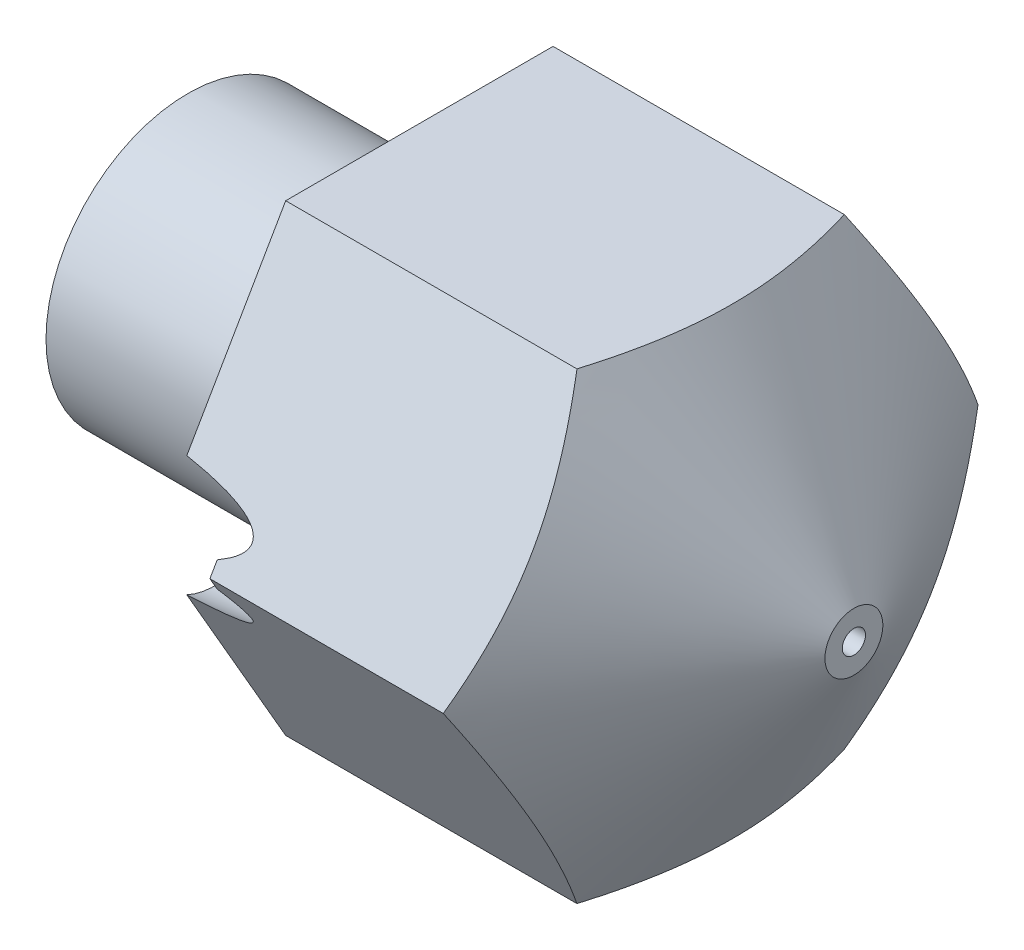
ISO-10303-21;
HEADER;
FILE_DESCRIPTION(('STEP AP214'),'2;1');
FILE_NAME('part.step','',(''),(''),'','','');
FILE_SCHEMA(('AUTOMOTIVE_DESIGN { 1 0 10303 214 1 1 1 1 }'));
ENDSEC;
DATA;
#1=APPLICATION_CONTEXT('core data for automotive mechanical design processes');
#2=APPLICATION_PROTOCOL_DEFINITION('international standard','automotive_design',2000,#1);
#3=PRODUCT_CONTEXT('',#1,'mechanical');
#4=PRODUCT('Part','Part','',(#3));
#5=PRODUCT_RELATED_PRODUCT_CATEGORY('part','',(#4));
#6=PRODUCT_DEFINITION_FORMATION('','',#4);
#7=PRODUCT_DEFINITION_CONTEXT('part definition',#1,'design');
#8=PRODUCT_DEFINITION('design','',#6,#7);
#9=PRODUCT_DEFINITION_SHAPE('','',#8);
#10=(LENGTH_UNIT() NAMED_UNIT(*) SI_UNIT(.MILLI.,.METRE.));
#11=(NAMED_UNIT(*) PLANE_ANGLE_UNIT() SI_UNIT($,.RADIAN.));
#12=(NAMED_UNIT(*) SI_UNIT($,.STERADIAN.) SOLID_ANGLE_UNIT());
#13=UNCERTAINTY_MEASURE_WITH_UNIT(LENGTH_MEASURE(1.E-05),#10,'distance_accuracy_value','');
#14=(GEOMETRIC_REPRESENTATION_CONTEXT(3) GLOBAL_UNCERTAINTY_ASSIGNED_CONTEXT((#13)) GLOBAL_UNIT_ASSIGNED_CONTEXT((#10,
#11,#12)) REPRESENTATION_CONTEXT('',''));
#15=CARTESIAN_POINT('',(0.,0.,0.));
#16=DIRECTION('',(0.,0.,1.));
#17=DIRECTION('',(1.,0.,0.));
#18=AXIS2_PLACEMENT_3D('',#15,#16,#17);
#19=CARTESIAN_POINT('',(-11.5064546427052,0.,4.618802153517));
#20=DIRECTION('',(0.,-0.5,0.866025403784439));
#21=DIRECTION('',(0.,-0.866025403784439,-0.5));
#22=AXIS2_PLACEMENT_3D('',#19,#20,#21);
#23=PLANE('',#22);
#24=DIRECTION('',(1.,0.,0.));
#25=VECTOR('',#24,1.);
#26=CARTESIAN_POINT('',(-11.5064546427052,0.,4.618802153517));
#27=LINE('',#26,#25);
#28=CARTESIAN_POINT('',(-6.50645464270517,0.,4.618802153517));
#29=VERTEX_POINT('',#28);
#30=CARTESIAN_POINT('',(-2.47482601161343,0.,4.618802153517));
#31=VERTEX_POINT('',#30);
#32=EDGE_CURVE('E115',#29,#31,#27,.T.);
#33=ORIENTED_EDGE('',*,*,#32,.F.);
#34=DIRECTION('',(0.,-0.866025403784439,-0.5));
#35=VECTOR('',#34,1.);
#36=CARTESIAN_POINT('',(-6.50645464270517,0.,4.618802153517));
#37=LINE('',#36,#35);
#38=CARTESIAN_POINT('',(-6.50645464270517,-0.218664139077677,4.49255635395839));
#39=VERTEX_POINT('',#38);
#40=EDGE_CURVE('E105',#29,#39,#37,.T.);
#41=ORIENTED_EDGE('',*,*,#40,.T.);
#42=CARTESIAN_POINT('',(-13.7241967777646,0.,4.618802153517));
#43=DIRECTION('',(0.,-0.5,0.866025403784439));
#44=DIRECTION('',(0.996136109887344,-0.0760568072816772,-0.0439114181577798));
#45=AXIS2_PLACEMENT_3D('',#42,#43,#44);
#46=ELLIPSE('',#45,7.64710368388143,1.15);
#47=CARTESIAN_POINT('',(-7.50645464270517,-1.04156382752938,4.01745499731474));
#48=VERTEX_POINT('',#47);
#49=EDGE_CURVE('E271',#39,#48,#46,.F.);
#50=ORIENTED_EDGE('',*,*,#49,.T.);
#51=DIRECTION('',(0.,-0.866025403784439,-0.5));
#52=VECTOR('',#51,1.);
#53=CARTESIAN_POINT('',(-7.50645464270517,-0.162500000000001,4.52498273477369));
#54=LINE('',#53,#52);
#55=CARTESIAN_POINT('',(-7.50645464270517,-4.,2.3094010767585));
#56=VERTEX_POINT('',#55);
#57=EDGE_CURVE('E212',#48,#56,#54,.T.);
#58=ORIENTED_EDGE('',*,*,#57,.T.);
#59=DIRECTION('',(1.,0.,0.));
#60=VECTOR('',#59,1.);
#61=CARTESIAN_POINT('',(-11.5064546427052,-4.,2.3094010767585));
#62=LINE('',#61,#60);
#63=CARTESIAN_POINT('',(-2.47482601161343,-4.,2.3094010767585));
#64=VERTEX_POINT('',#63);
#65=EDGE_CURVE('E123',#56,#64,#62,.T.);
#66=ORIENTED_EDGE('',*,*,#65,.T.);
#67=CARTESIAN_POINT('',(-2.47489539562319,-4.0002,2.30928560670466));
#68=CARTESIAN_POINT('',(-2.41367478697621,-3.82378429682606,2.41113926042142));
#69=CARTESIAN_POINT('',(-2.35797178173678,-3.64571916244249,2.51394521369105));
#70=CARTESIAN_POINT('',(-2.26076985854489,-3.28623804524028,2.72149173347634));
#71=CARTESIAN_POINT('',(-2.21930897658134,-3.10481443247441,2.82623670514407));
#72=CARTESIAN_POINT('',(-2.15499427747914,-2.74440433604145,3.0343195713383));
#73=CARTESIAN_POINT('',(-2.13167110146483,-2.56548305149692,3.13761982313383));
#74=CARTESIAN_POINT('',(-2.10412091253113,-2.20674872295431,3.34473518428547));
#75=CARTESIAN_POINT('',(-2.0998679636377,-2.02693722328528,3.44854940202277));
#76=CARTESIAN_POINT('',(-2.11006491766766,-1.6925623081736,3.64160084927276));
#77=CARTESIAN_POINT('',(-2.12201661064547,-1.53793649904065,3.73087410179934));
#78=CARTESIAN_POINT('',(-2.15945066700012,-1.229780492834,3.90878805493514));
#79=CARTESIAN_POINT('',(-2.18494668088695,-1.07625155972088,3.9974280257964));
#80=CARTESIAN_POINT('',(-2.24851595632026,-0.767426700908233,4.17572814116433));
#81=CARTESIAN_POINT('',(-2.28687487915166,-0.612176059364386,4.26536214085153));
#82=CARTESIAN_POINT('',(-2.37378030891487,-0.304163185150552,4.44319345669276));
#83=CARTESIAN_POINT('',(-2.42230484006763,-0.151396338503894,4.53139343672746));
#84=CARTESIAN_POINT('',(-2.47489539562319,0.000199999999999923,4.61891762357084));
#85=B_SPLINE_CURVE_WITH_KNOTS('',3,(#67,#68,#69,#70,#71,#72,#73,#74,#75,#76,#77,#78,#79,#80,#81,
#82,#83,#84),.UNSPECIFIED.,.F.,.F.,(4,2,2,2,2,2,2,2,4),(0.,0.638405548690308,1.27850304746714,
1.90142763305445,2.5235047685458,3.05979879780538,3.59663435398865,4.14628272995038,
4.69475492844599),.UNSPECIFIED.);
#86=EDGE_CURVE('E121',#64,#31,#85,.T.);
#87=ORIENTED_EDGE('',*,*,#86,.T.);
#88=EDGE_LOOP('',(#33,#41,#50,#58,#66,#87));
#89=FACE_BOUND('',#88,.T.);
#90=ADVANCED_FACE('F33',(#89),#23,.T.);
#91=CARTESIAN_POINT('',(-11.5064546427052,4.,2.3094010767585));
#92=DIRECTION('',(0.,0.5,0.866025403784439));
#93=DIRECTION('',(0.,-0.866025403784439,0.5));
#94=AXIS2_PLACEMENT_3D('',#91,#92,#93);
#95=PLANE('',#94);
#96=CARTESIAN_POINT('',(-13.7241967777646,0.,4.618802153517));
#97=DIRECTION('',(0.,0.5,0.866025403784439));
#98=DIRECTION('',(0.996136109887344,0.0760568072816771,-0.0439114181577798));
#99=AXIS2_PLACEMENT_3D('',#96,#97,#98);
#100=ELLIPSE('',#99,7.64710368388143,1.15);
#101=CARTESIAN_POINT('',(-7.50645464270517,1.04156382752938,4.01745499731474));
#102=VERTEX_POINT('',#101);
#103=CARTESIAN_POINT('',(-6.50645464270517,0.218664139077678,4.49255635395839));
#104=VERTEX_POINT('',#103);
#105=EDGE_CURVE('E42',#102,#104,#100,.F.);
#106=ORIENTED_EDGE('',*,*,#105,.T.);
#107=DIRECTION('',(0.,-0.866025403784439,0.5));
#108=VECTOR('',#107,1.);
#109=CARTESIAN_POINT('',(-6.50645464270517,4.,2.3094010767585));
#110=LINE('',#109,#108);
#111=EDGE_CURVE('E49',#104,#29,#110,.T.);
#112=ORIENTED_EDGE('',*,*,#111,.T.);
#113=ORIENTED_EDGE('',*,*,#32,.T.);
#114=CARTESIAN_POINT('',(-2.4748953956232,-0.000200000000000242,4.61891762357084));
#115=CARTESIAN_POINT('',(-2.41367478697621,0.176215703173942,4.51706396985409));
#116=CARTESIAN_POINT('',(-2.35797178173678,0.354280837557507,4.41425801658445));
#117=CARTESIAN_POINT('',(-2.26076985854489,0.713761954759723,4.20671149679917));
#118=CARTESIAN_POINT('',(-2.21930897658134,0.895185567525586,4.10196652513144));
#119=CARTESIAN_POINT('',(-2.15499427747914,1.25559566395855,3.89388365893721));
#120=CARTESIAN_POINT('',(-2.13167110146483,1.43451694850308,3.79058340714167));
#121=CARTESIAN_POINT('',(-2.10412091253113,1.79325127704569,3.58346804599004));
#122=CARTESIAN_POINT('',(-2.0998679636377,1.97306277671472,3.47965382825273));
#123=CARTESIAN_POINT('',(-2.11006491766766,2.3074376918264,3.28660238100275));
#124=CARTESIAN_POINT('',(-2.12201661064547,2.46206350095935,3.19732912847617));
#125=CARTESIAN_POINT('',(-2.15945066700012,2.77021950716599,3.01941517534037));
#126=CARTESIAN_POINT('',(-2.18494668088695,2.92374844027912,2.93077520447911));
#127=CARTESIAN_POINT('',(-2.24851595632026,3.23257329909177,2.75247508911118));
#128=CARTESIAN_POINT('',(-2.28687487915166,3.38782394063561,2.66284108942398));
#129=CARTESIAN_POINT('',(-2.37378030891487,3.69583681484945,2.48500977358275));
#130=CARTESIAN_POINT('',(-2.42230484006763,3.84860366149611,2.39680979354805));
#131=CARTESIAN_POINT('',(-2.4748953956232,4.0002,2.30928560670466));
#132=B_SPLINE_CURVE_WITH_KNOTS('',3,(#114,#115,#116,#117,#118,#119,#120,#121,#122,#123,#124,
#125,#126,#127,#128,#129,#130,#131),.UNSPECIFIED.,.F.,.F.,(4,2,2,2,2,2,2,2,4),(0.,
0.638405548690308,1.27850304746714,1.90142763305445,2.5235047685458,3.05979879780538,
3.59663435398865,4.14628272995038,4.69475492844599),.UNSPECIFIED.);
#133=CARTESIAN_POINT('',(-2.47482601161343,4.,2.3094010767585));
#134=VERTEX_POINT('',#133);
#135=EDGE_CURVE('E233',#31,#134,#132,.T.);
#136=ORIENTED_EDGE('',*,*,#135,.T.);
#137=DIRECTION('',(1.,0.,0.));
#138=VECTOR('',#137,1.);
#139=CARTESIAN_POINT('',(-11.5064546427052,4.,2.3094010767585));
#140=LINE('',#139,#138);
#141=CARTESIAN_POINT('',(-7.50645464270517,4.,2.3094010767585));
#142=VERTEX_POINT('',#141);
#143=EDGE_CURVE('E124',#142,#134,#140,.T.);
#144=ORIENTED_EDGE('',*,*,#143,.F.);
#145=DIRECTION('',(0.,-0.866025403784439,0.5));
#146=VECTOR('',#145,1.);
#147=CARTESIAN_POINT('',(-7.50645464270517,3.8375,2.40322049550182));
#148=LINE('',#147,#146);
#149=EDGE_CURVE('E210',#142,#102,#148,.T.);
#150=ORIENTED_EDGE('',*,*,#149,.T.);
#151=EDGE_LOOP('',(#106,#112,#113,#136,#144,#150));
#152=FACE_BOUND('',#151,.T.);
#153=ADVANCED_FACE('F114',(#152),#95,.T.);
#154=CARTESIAN_POINT('',(-1.80463913019382,0.,2.51706254214026));
#155=DIRECTION('',(0.984807753012207,0.,-0.173648177666938));
#156=DIRECTION('',(-0.173648177666938,0.,-0.984807753012207));
#157=AXIS2_PLACEMENT_3D('',#154,#155,#156);
#158=CYLINDRICAL_SURFACE('',#157,1.15);
#159=CARTESIAN_POINT('',(-2.48513115570659,0.,2.63705164639512));
#160=DIRECTION('',(0.984807753012207,0.,-0.173648177666938));
#161=DIRECTION('',(-0.173648177666938,0.,-0.984807753012207));
#162=AXIS2_PLACEMENT_3D('',#159,#160,#161);
#163=CIRCLE('',#162,1.15);
#164=CARTESIAN_POINT('',(-2.68482656002357,0.,1.50452273043108));
#165=VERTEX_POINT('',#164);
#166=EDGE_CURVE('E110',#165,#165,#163,.T.);
#167=ORIENTED_EDGE('',*,*,#166,.T.);
#168=EDGE_LOOP('',(#167));
#169=FACE_BOUND('',#168,.T.);
#170=ORIENTED_EDGE('',*,*,#49,.F.);
#171=CARTESIAN_POINT('',(-6.50645464270517,0.,3.34611947530964));
#172=DIRECTION('',(-1.,0.,0.));
#173=DIRECTION('',(0.,0.,-1.));
#174=AXIS2_PLACEMENT_3D('',#171,#172,#173);
#175=ELLIPSE('',#174,1.16774060366861,1.15);
#176=EDGE_CURVE('E12',#39,#104,#175,.T.);
#177=ORIENTED_EDGE('',*,*,#176,.T.);
#178=ORIENTED_EDGE('',*,*,#105,.F.);
#179=CARTESIAN_POINT('',(-7.50645464270517,0.,3.52244645601812));
#180=DIRECTION('',(1.,0.,0.));
#181=DIRECTION('',(0.,0.,-1.));
#182=AXIS2_PLACEMENT_3D('',#179,#180,#181);
#183=ELLIPSE('',#182,1.16774060366861,1.15);
#184=CARTESIAN_POINT('',(-7.50645464270516,0.380101452319349,2.42033528378709));
#185=VERTEX_POINT('',#184);
#186=EDGE_CURVE('E244',#102,#185,#183,.F.);
#187=ORIENTED_EDGE('',*,*,#186,.T.);
#188=CARTESIAN_POINT('',(-7.50645464270516,0.380101452319349,2.42033528378709));
#189=CARTESIAN_POINT('',(-7.53164557622106,0.371435900180456,2.42169599242348));
#190=CARTESIAN_POINT('',(-7.5567329046638,0.362487884122019,2.42305426441452));
#191=CARTESIAN_POINT('',(-7.60668126871648,0.343879584693786,2.42576466352813));
#192=CARTESIAN_POINT('',(-7.63154194285403,0.334218332152243,2.42711677953681));
#193=CARTESIAN_POINT('',(-7.70545189893425,0.304061201673389,2.43114548191707));
#194=CARTESIAN_POINT('',(-7.75403308885711,0.282324234012543,2.43380544463165));
#195=CARTESIAN_POINT('',(-7.821767948487,0.24711175827591,2.43752905836251));
#196=CARTESIAN_POINT('',(-7.84207994516474,0.235881814722992,2.43864771852817));
#197=CARTESIAN_POINT('',(-7.88197417843386,0.211908624149625,2.44084854035234));
#198=CARTESIAN_POINT('',(-7.90155164505592,0.199157187743113,2.44193046016505));
#199=CARTESIAN_POINT('',(-7.93957156096945,0.171441116837734,2.44403485015953));
#200=CARTESIAN_POINT('',(-7.9579908865134,0.156444385121634,2.4450560947584));
#201=CARTESIAN_POINT('',(-7.99194195256509,0.123490803109564,2.44694107390681));
#202=CARTESIAN_POINT('',(-8.00750119895349,0.105565665798615,2.44780630711413));
#203=CARTESIAN_POINT('',(-8.02465794934448,0.0782455904227737,2.44876121908476));
#204=CARTESIAN_POINT('',(-8.02889427079774,0.0705450958185572,2.44899711121059));
#205=CARTESIAN_POINT('',(-8.03620780265041,0.0546031161092929,2.4494044571606));
#206=CARTESIAN_POINT('',(-8.03928580869984,0.0463620069400535,2.44957595521706));
#207=CARTESIAN_POINT('',(-8.0440032331517,0.0293659468760754,2.44983883412218));
#208=CARTESIAN_POINT('',(-8.04562655819751,0.0206063637979844,2.44992931869706));
#209=CARTESIAN_POINT('',(-8.04714791533786,0.0029374474368664,2.45001411866368));
#210=CARTESIAN_POINT('',(-8.04704710882139,-0.00597178100285546,2.45000849879216));
#211=CARTESIAN_POINT('',(-8.04524803036998,-0.0226120057340384,2.4499082206434));
#212=CARTESIAN_POINT('',(-8.04372915363584,-0.0303636008972351,2.44982356138466));
#213=CARTESIAN_POINT('',(-8.0395127256261,-0.0455341912722249,2.44958859981077));
#214=CARTESIAN_POINT('',(-8.03681445405622,-0.0529529801707095,2.44943825738081));
#215=CARTESIAN_POINT('',(-8.02874730812015,-0.0712506575162645,2.44898891261733));
#216=CARTESIAN_POINT('',(-8.02272300890597,-0.0818368463904243,2.44865346729553));
#217=CARTESIAN_POINT('',(-8.00914337013584,-0.101971747589523,2.44789780946839));
#218=CARTESIAN_POINT('',(-8.00158325637706,-0.11151707853701,2.44747733265477));
#219=CARTESIAN_POINT('',(-7.97770997501408,-0.138454926868376,2.44615053656435));
#220=CARTESIAN_POINT('',(-7.95997361076383,-0.154561353514317,2.44516600805385));
#221=CARTESIAN_POINT('',(-7.92254451836607,-0.184459325357858,2.44309185555301));
#222=CARTESIAN_POINT('',(-7.90283718982718,-0.198231190447342,2.44200144928932));
#223=CARTESIAN_POINT('',(-7.85279184553058,-0.23019202888415,2.4392373995569));
#224=CARTESIAN_POINT('',(-7.8218307447365,-0.247393290658528,2.43753162381855));
#225=CARTESIAN_POINT('',(-7.7586755339149,-0.279461884113285,2.4340619145898));
#226=CARTESIAN_POINT('',(-7.72647841482851,-0.29432300295349,2.43229784084415));
#227=CARTESIAN_POINT('',(-7.66310400683827,-0.321616166427211,2.42883571108761));
#228=CARTESIAN_POINT('',(-7.63196383459694,-0.334135463711245,2.4271391481308));
#229=CARTESIAN_POINT('',(-7.5694076727318,-0.357937424025205,2.42374068794934));
#230=CARTESIAN_POINT('',(-7.5379941236128,-0.36922647693033,2.42203887066743));
#231=CARTESIAN_POINT('',(-7.50645464270516,-0.380101452319349,2.42033528378709));
#232=B_SPLINE_CURVE_WITH_KNOTS('',3,(#188,#189,#190,#191,#192,#193,#194,#195,#196,#197,#198,
#199,#200,#201,#202,#203,#204,#205,#206,#207,#208,#209,#210,#211,#212,#213,#214,#215,#216,#217,
#218,#219,#220,#221,#222,#223,#224,#225,#226,#227,#228,#229,#230,#231),.UNSPECIFIED.,.F.,.F.,(4,
2,2,2,2,2,2,2,2,2,2,2,2,2,2,2,2,2,2,2,2,4),(0.,0.0800071136384732,0.160125019187223,
0.319715732000404,0.389389771677658,0.45945735456332,0.530644094508613,0.601105612154475,
0.627408038024021,0.653692363563392,0.680264009594907,0.70681775745573,0.730410359933461,
0.754017391347453,0.790360980955193,0.826819325545735,0.898355501240315,0.970467586938541,
1.07665380964378,1.18311735827324,1.28390617303383,1.38414366615221),.UNSPECIFIED.);
#233=CARTESIAN_POINT('',(-7.50645464270516,-0.380101452319349,2.42033528378709));
#234=VERTEX_POINT('',#233);
#235=EDGE_CURVE('E136',#185,#234,#232,.T.);
#236=ORIENTED_EDGE('',*,*,#235,.T.);
#237=EDGE_CURVE('E243',#234,#48,#183,.F.);
#238=ORIENTED_EDGE('',*,*,#237,.T.);
#239=EDGE_LOOP('',(#170,#177,#178,#187,#236,#238));
#240=FACE_BOUND('',#239,.T.);
#241=ADVANCED_FACE('F249',(#169,#240),#158,.F.);
#242=CARTESIAN_POINT('',(-7.50645464270517,2.45,0.));
#243=DIRECTION('',(1.,0.,0.));
#244=DIRECTION('',(0.,0.,-1.));
#245=AXIS2_PLACEMENT_3D('',#242,#243,#244);
#246=PLANE('',#245);
#247=ORIENTED_EDGE('',*,*,#237,.F.);
#248=CARTESIAN_POINT('',(-7.50645464270516,0.,0.));
#249=DIRECTION('',(-1.,0.,0.));
#250=DIRECTION('',(0.,0.,1.));
#251=AXIS2_PLACEMENT_3D('',#248,#249,#250);
#252=CIRCLE('',#251,2.45);
#253=EDGE_CURVE('E173',#185,#234,#252,.T.);
#254=ORIENTED_EDGE('',*,*,#253,.F.);
#255=ORIENTED_EDGE('',*,*,#186,.F.);
#256=ORIENTED_EDGE('',*,*,#149,.F.);
#257=DIRECTION('',(0.,0.,1.));
#258=VECTOR('',#257,1.);
#259=CARTESIAN_POINT('',(-7.50645464270517,4.,0.));
#260=LINE('',#259,#258);
#261=CARTESIAN_POINT('',(-7.50645464270517,4.,-2.3094010767585));
#262=VERTEX_POINT('',#261);
#263=EDGE_CURVE('E208',#262,#142,#260,.T.);
#264=ORIENTED_EDGE('',*,*,#263,.F.);
#265=DIRECTION('',(0.,0.866025403784439,0.5));
#266=VECTOR('',#265,1.);
#267=CARTESIAN_POINT('',(-7.50645464270517,3.8375,-2.40322049550182));
#268=LINE('',#267,#266);
#269=CARTESIAN_POINT('',(-7.50645464270517,0.,-4.61880215351701));
#270=VERTEX_POINT('',#269);
#271=EDGE_CURVE('E206',#270,#262,#268,.T.);
#272=ORIENTED_EDGE('',*,*,#271,.F.);
#273=DIRECTION('',(0.,0.866025403784439,-0.5));
#274=VECTOR('',#273,1.);
#275=CARTESIAN_POINT('',(-7.50645464270517,-0.162500000000001,-4.52498273477369));
#276=LINE('',#275,#274);
#277=CARTESIAN_POINT('',(-7.50645464270517,-4.,-2.30940107675851));
#278=VERTEX_POINT('',#277);
#279=EDGE_CURVE('E216',#278,#270,#276,.T.);
#280=ORIENTED_EDGE('',*,*,#279,.F.);
#281=DIRECTION('',(0.,0.,-1.));
#282=VECTOR('',#281,1.);
#283=CARTESIAN_POINT('',(-7.50645464270517,-4.,0.));
#284=LINE('',#283,#282);
#285=EDGE_CURVE('E214',#56,#278,#284,.T.);
#286=ORIENTED_EDGE('',*,*,#285,.F.);
#287=ORIENTED_EDGE('',*,*,#57,.F.);
#288=EDGE_LOOP('',(#247,#254,#255,#256,#264,#272,#280,#286,#287));
#289=FACE_BOUND('',#288,.T.);
#290=ADVANCED_FACE('F164',(#289),#246,.F.);
#291=CARTESIAN_POINT('',(-1000.,0.,0.));
#292=DIRECTION('',(-1.,0.,0.));
#293=DIRECTION('',(0.,0.,1.));
#294=AXIS2_PLACEMENT_3D('',#291,#292,#293);
#295=CYLINDRICAL_SURFACE('',#294,2.45);
#296=CARTESIAN_POINT('',(-11.5064546427052,0.,0.));
#297=DIRECTION('',(-1.,0.,0.));
#298=DIRECTION('',(0.,0.,1.));
#299=AXIS2_PLACEMENT_3D('',#296,#297,#298);
#300=CIRCLE('',#299,2.45);
#301=CARTESIAN_POINT('',(-11.5064546427052,0.,2.45));
#302=VERTEX_POINT('',#301);
#303=EDGE_CURVE('E182',#302,#302,#300,.T.);
#304=ORIENTED_EDGE('',*,*,#303,.F.);
#305=EDGE_LOOP('',(#304));
#306=FACE_BOUND('',#305,.T.);
#307=ORIENTED_EDGE('',*,*,#235,.F.);
#308=ORIENTED_EDGE('',*,*,#253,.T.);
#309=EDGE_LOOP('',(#307,#308));
#310=FACE_BOUND('',#309,.T.);
#311=ADVANCED_FACE('F246',(#306,#310),#295,.T.);
#312=CARTESIAN_POINT('',(0.,0.,0.));
#313=DIRECTION('',(-1.,0.,0.));
#314=DIRECTION('',(0.,0.,1.));
#315=AXIS2_PLACEMENT_3D('',#312,#313,#314);
#316=CONICAL_SURFACE('',#315,0.5,1.02974425867681);
#317=CARTESIAN_POINT('',(0.,0.,0.));
#318=DIRECTION('',(-1.,0.,0.));
#319=DIRECTION('',(0.,0.,1.));
#320=AXIS2_PLACEMENT_3D('',#317,#318,#319);
#321=CIRCLE('',#320,0.5);
#322=CARTESIAN_POINT('',(0.,0.,0.5));
#323=VERTEX_POINT('',#322);
#324=EDGE_CURVE('E203',#323,#323,#321,.T.);
#325=ORIENTED_EDGE('',*,*,#324,.T.);
#326=EDGE_LOOP('',(#325));
#327=FACE_BOUND('',#326,.T.);
#328=CARTESIAN_POINT('',(-2.4748953956232,0.00019999999999845,-4.61891762357085));
#329=CARTESIAN_POINT('',(-2.41367478697621,-0.176215703173944,-4.51706396985409));
#330=CARTESIAN_POINT('',(-2.35797178173678,-0.354280837557509,-4.41425801658445));
#331=CARTESIAN_POINT('',(-2.26076985854489,-0.713761954759725,-4.20671149679917));
#332=CARTESIAN_POINT('',(-2.21930897658134,-0.895185567525588,-4.10196652513144));
#333=CARTESIAN_POINT('',(-2.15499427747915,-1.25559566395855,-3.89388365893721));
#334=CARTESIAN_POINT('',(-2.13167110146483,-1.43451694850308,-3.79058340714167));
#335=CARTESIAN_POINT('',(-2.10412091253114,-1.79325127704569,-3.58346804599004));
#336=CARTESIAN_POINT('',(-2.0998679636377,-1.97306277671472,-3.47965382825273));
#337=CARTESIAN_POINT('',(-2.11006491766766,-2.3074376918264,-3.28660238100275));
#338=CARTESIAN_POINT('',(-2.12201661064547,-2.46206350095935,-3.19732912847617));
#339=CARTESIAN_POINT('',(-2.15945066700013,-2.770219507166,-3.01941517534037));
#340=CARTESIAN_POINT('',(-2.18494668088695,-2.92374844027912,-2.93077520447911));
#341=CARTESIAN_POINT('',(-2.24851595632026,-3.23257329909177,-2.75247508911118));
#342=CARTESIAN_POINT('',(-2.28687487915166,-3.38782394063561,-2.66284108942398));
#343=CARTESIAN_POINT('',(-2.37378030891487,-3.69583681484945,-2.48500977358275));
#344=CARTESIAN_POINT('',(-2.42230484006763,-3.8486036614961,-2.39680979354805));
#345=CARTESIAN_POINT('',(-2.4748953956232,-4.0002,-2.30928560670467));
#346=B_SPLINE_CURVE_WITH_KNOTS('',3,(#328,#329,#330,#331,#332,#333,#334,#335,#336,#337,#338,
#339,#340,#341,#342,#343,#344,#345),.UNSPECIFIED.,.F.,.F.,(4,2,2,2,2,2,2,2,4),(0.,
0.638405548690308,1.27850304746714,1.90142763305445,2.5235047685458,3.05979879780538,
3.59663435398865,4.14628272995038,4.69475492844599),.UNSPECIFIED.);
#347=CARTESIAN_POINT('',(-2.47482601161343,0.,-4.61880215351701));
#348=VERTEX_POINT('',#347);
#349=CARTESIAN_POINT('',(-2.47482601161343,-4.,-2.30940107675851));
#350=VERTEX_POINT('',#349);
#351=EDGE_CURVE('E167',#348,#350,#346,.T.);
#352=ORIENTED_EDGE('',*,*,#351,.F.);
#353=CARTESIAN_POINT('',(-2.4748953956232,4.0002,-2.30928560670466));
#354=CARTESIAN_POINT('',(-2.41367478697621,3.82378429682606,-2.41113926042142));
#355=CARTESIAN_POINT('',(-2.35797178173678,3.64571916244249,-2.51394521369105));
#356=CARTESIAN_POINT('',(-2.26076985854489,3.28623804524028,-2.72149173347634));
#357=CARTESIAN_POINT('',(-2.21930897658134,3.10481443247441,-2.82623670514407));
#358=CARTESIAN_POINT('',(-2.15499427747914,2.74440433604145,-3.0343195713383));
#359=CARTESIAN_POINT('',(-2.13167110146483,2.56548305149692,-3.13761982313384));
#360=CARTESIAN_POINT('',(-2.10412091253113,2.20674872295432,-3.34473518428547));
#361=CARTESIAN_POINT('',(-2.0998679636377,2.02693722328528,-3.44854940202277));
#362=CARTESIAN_POINT('',(-2.11006491766766,1.6925623081736,-3.64160084927276));
#363=CARTESIAN_POINT('',(-2.12201661064547,1.53793649904065,-3.73087410179934));
#364=CARTESIAN_POINT('',(-2.15945066700013,1.22978049283401,-3.90878805493514));
#365=CARTESIAN_POINT('',(-2.18494668088695,1.07625155972088,-3.9974280257964));
#366=CARTESIAN_POINT('',(-2.24851595632026,0.767426700908233,-4.17572814116433));
#367=CARTESIAN_POINT('',(-2.28687487915166,0.612176059364386,-4.26536214085153));
#368=CARTESIAN_POINT('',(-2.37378030891487,0.30416318515055,-4.44319345669276));
#369=CARTESIAN_POINT('',(-2.42230484006763,0.151396338503893,-4.53139343672746));
#370=CARTESIAN_POINT('',(-2.4748953956232,-0.000200000000001527,-4.61891762357085));
#371=B_SPLINE_CURVE_WITH_KNOTS('',3,(#353,#354,#355,#356,#357,#358,#359,#360,#361,#362,#363,
#364,#365,#366,#367,#368,#369,#370),.UNSPECIFIED.,.F.,.F.,(4,2,2,2,2,2,2,2,4),(0.,
0.638405548690308,1.27850304746714,1.90142763305445,2.5235047685458,3.05979879780539,
3.59663435398866,4.14628272995038,4.694754928446),.UNSPECIFIED.);
#372=CARTESIAN_POINT('',(-2.47482601161343,4.,-2.3094010767585));
#373=VERTEX_POINT('',#372);
#374=EDGE_CURVE('E137',#373,#348,#371,.T.);
#375=ORIENTED_EDGE('',*,*,#374,.F.);
#376=CARTESIAN_POINT('',(-4.17158437319795,4.,-6.27642569772269));
#377=CARTESIAN_POINT('',(-4.08310245718994,4.,-6.10175760308876));
#378=CARTESIAN_POINT('',(-3.99543083455712,4.,-5.92667209345015));
#379=CARTESIAN_POINT('',(-3.82216386134036,4.,-5.57544347066715));
#380=CARTESIAN_POINT('',(-3.73656884068713,4.,-5.39930019493941));
#381=CARTESIAN_POINT('',(-3.56746675133272,4.,-5.04479830166164));
#382=CARTESIAN_POINT('',(-3.48397406204416,4.,-4.86643280184195));
#383=CARTESIAN_POINT('',(-3.32024725563806,4.,-4.50821812487903));
#384=CARTESIAN_POINT('',(-3.24001297985956,4.,-4.3283690204908));
#385=CARTESIAN_POINT('',(-3.08084264363835,4.,-3.96034775542851));
#386=CARTESIAN_POINT('',(-3.0020582259262,4.,-3.77210965507247));
#387=CARTESIAN_POINT('',(-2.85019882526013,4.,-3.39330156397307));
#388=CARTESIAN_POINT('',(-2.77712453250478,4.,-3.20273129454399));
#389=CARTESIAN_POINT('',(-2.63856539056958,4.,-2.81927894618398));
#390=CARTESIAN_POINT('',(-2.57306486184306,4.,-2.62640258982391));
#391=CARTESIAN_POINT('',(-2.45171997886453,4.,-2.23766422790783));
#392=CARTESIAN_POINT('',(-2.39587240345664,4.,-2.0418032421446));
#393=CARTESIAN_POINT('',(-2.29681354922711,4.,-1.64805597593383));
#394=CARTESIAN_POINT('',(-2.25353115742597,4.,-1.45018792397771));
#395=CARTESIAN_POINT('',(-2.18207681477481,4.,-1.05170241588964));
#396=CARTESIAN_POINT('',(-2.15390263627178,4.,-0.851085369563354));
#397=CARTESIAN_POINT('',(-2.11537898654491,4.,-0.451042971807112));
#398=CARTESIAN_POINT('',(-2.10477670044513,4.,-0.251642596819304));
#399=CARTESIAN_POINT('',(-2.10165625220595,4.,0.147328787170066));
#400=CARTESIAN_POINT('',(-2.10913894955972,4.,0.346899803830817));
#401=CARTESIAN_POINT('',(-2.13588875563733,4.,0.676459471870371));
#402=CARTESIAN_POINT('',(-2.15024343520416,4.,0.806875104286666));
#403=CARTESIAN_POINT('',(-2.18585474487559,4.,1.06676600574334));
#404=CARTESIAN_POINT('',(-2.2071121318168,4.,1.19624117007533));
#405=CARTESIAN_POINT('',(-2.28019828403437,4.,1.58303567505728));
#406=CARTESIAN_POINT('',(-2.34133158282717,4.,1.83862027075575));
#407=CARTESIAN_POINT('',(-2.44779254877301,4.,2.22102402280699));
#408=CARTESIAN_POINT('',(-2.48629004823398,4.,2.34985662299016));
#409=CARTESIAN_POINT('',(-2.56741588559758,4.,2.60622682917234));
#410=CARTESIAN_POINT('',(-2.61004425944711,4.,2.73376442389154));
#411=CARTESIAN_POINT('',(-2.69876107076017,4.,2.98758419663203));
#412=CARTESIAN_POINT('',(-2.7448486463109,4.,3.11386667856188));
#413=CARTESIAN_POINT('',(-2.83994164023596,4.,3.36531980439222));
#414=CARTESIAN_POINT('',(-2.88894696457798,4.,3.49049048397429));
#415=CARTESIAN_POINT('',(-3.03652965882783,4.,3.85682629779044));
#416=CARTESIAN_POINT('',(-3.13847768937692,4.,4.09663304835284));
#417=CARTESIAN_POINT('',(-3.34899270080483,4.,4.57333559994927));
#418=CARTESIAN_POINT('',(-3.45756073621507,4.,4.81023092994999));
#419=CARTESIAN_POINT('',(-3.6796277119503,4.,5.28184518677189));
#420=CARTESIAN_POINT('',(-3.79312925616655,4.,5.51656288296023));
#421=CARTESIAN_POINT('',(-4.02378446605818,4.,5.98417214821587));
#422=CARTESIAN_POINT('',(-4.14093791235631,4.,6.217063825928));
#423=CARTESIAN_POINT('',(-4.37829362335282,4.,6.68190077543575));
#424=CARTESIAN_POINT('',(-4.49850176461033,4.,6.91384303973238));
#425=CARTESIAN_POINT('',(-4.74111499153322,4.,7.37657702754274));
#426=CARTESIAN_POINT('',(-4.86352010459731,4.,7.60736873666183));
#427=CARTESIAN_POINT('',(-5.23324092096505,4.,8.29821851182995));
#428=CARTESIAN_POINT('',(-5.48313636911954,4.,8.75689512889543));
#429=CARTESIAN_POINT('',(-5.95650144665833,4.,9.61570037688454));
#430=CARTESIAN_POINT('',(-6.17945586922184,4.,10.0161144444206));
#431=CARTESIAN_POINT('',(-6.62788754775503,4.,10.8155723494239));
#432=CARTESIAN_POINT('',(-6.85336502017069,4.,11.2146160654345));
#433=CARTESIAN_POINT('',(-7.30522220284898,4.,12.0099946055275));
#434=CARTESIAN_POINT('',(-7.53159424841186,4.,12.4063337908447));
#435=CARTESIAN_POINT('',(-7.98573548428353,4.,13.1981566966311));
#436=CARTESIAN_POINT('',(-8.21350452753225,3.99999999999999,13.5936405014116));
#437=CARTESIAN_POINT('',(-8.44177939223066,4.,13.9888303716767));
#438=B_SPLINE_CURVE_WITH_KNOTS('',3,(#376,#377,#378,#379,#380,#381,#382,#383,#384,#385,#386,
#387,#388,#389,#390,#391,#392,#393,#394,#395,#396,#397,#398,#399,#400,#401,#402,#403,#404,#405,
#406,#407,#408,#409,#410,#411,#412,#413,#414,#415,#416,#417,#418,#419,#420,#421,#422,#423,#424,
#425,#426,#427,#428,#429,#430,#431,#432,#433,#434,#435,#436,#437),.UNSPECIFIED.,.F.,.F.,(4,2,2,
2,2,2,2,2,2,2,2,2,2,2,2,2,2,2,2,2,2,2,2,2,2,2,2,2,2,2,4),(0.,0.587409832689183,1.17491238989081,
1.7657054669899,2.35646974219915,2.96857851718351,3.58076116536629,4.19165285184721,
4.80234029074498,5.4095009629177,6.01657208674762,6.61483067607358,7.21311769834145,
7.60654444958534,8.00001435206665,8.78726530470698,9.19061097130707,9.59396014813898,
9.99720915589305,10.4004451748894,11.1820200900968,11.9637198329213,12.7458372870114,
13.527907847904,14.3116179088315,15.0953377503065,16.6622916777875,18.0371868097145,
19.4122008086913,20.7814901145384,22.1506376698957),.UNSPECIFIED.);
#439=EDGE_CURVE('E143',#134,#373,#438,.F.);
#440=ORIENTED_EDGE('',*,*,#439,.F.);
#441=ORIENTED_EDGE('',*,*,#135,.F.);
#442=ORIENTED_EDGE('',*,*,#86,.F.);
#443=CARTESIAN_POINT('',(-4.17158437319795,-4.,-6.27642569772269));
#444=CARTESIAN_POINT('',(-4.08310245718994,-4.,-6.10175760308876));
#445=CARTESIAN_POINT('',(-3.99543083455712,-4.,-5.92667209345015));
#446=CARTESIAN_POINT('',(-3.82216386134036,-4.,-5.57544347066715));
#447=CARTESIAN_POINT('',(-3.73656884068713,-4.,-5.39930019493941));
#448=CARTESIAN_POINT('',(-3.56746675133272,-4.,-5.04479830166164));
#449=CARTESIAN_POINT('',(-3.48397406204416,-4.,-4.86643280184195));
#450=CARTESIAN_POINT('',(-3.32024725563806,-4.,-4.50821812487903));
#451=CARTESIAN_POINT('',(-3.24001297985956,-4.,-4.32836902049081));
#452=CARTESIAN_POINT('',(-3.08084264363835,-4.,-3.96034775542851));
#453=CARTESIAN_POINT('',(-3.0020582259262,-4.,-3.77210965507247));
#454=CARTESIAN_POINT('',(-2.85019882526013,-4.,-3.39330156397307));
#455=CARTESIAN_POINT('',(-2.77712453250478,-4.,-3.20273129454399));
#456=CARTESIAN_POINT('',(-2.63856539056958,-4.,-2.81927894618398));
#457=CARTESIAN_POINT('',(-2.57306486184306,-4.,-2.62640258982392));
#458=CARTESIAN_POINT('',(-2.45171997886453,-4.,-2.23766422790784));
#459=CARTESIAN_POINT('',(-2.39587240345664,-4.,-2.0418032421446));
#460=CARTESIAN_POINT('',(-2.29681354922711,-4.,-1.64805597593383));
#461=CARTESIAN_POINT('',(-2.25353115742596,-4.,-1.45018792397771));
#462=CARTESIAN_POINT('',(-2.18207681477481,-4.,-1.05170241588965));
#463=CARTESIAN_POINT('',(-2.15390263627178,-4.,-0.851085369563359));
#464=CARTESIAN_POINT('',(-2.11537898654491,-4.,-0.451042971807117));
#465=CARTESIAN_POINT('',(-2.10477670044513,-4.,-0.251642596819309));
#466=CARTESIAN_POINT('',(-2.10165625220595,-4.,0.147328787170061));
#467=CARTESIAN_POINT('',(-2.10913894955972,-4.,0.346899803830812));
#468=CARTESIAN_POINT('',(-2.13588875563733,-4.,0.676459471870365));
#469=CARTESIAN_POINT('',(-2.15024343520416,-4.,0.80687510428666));
#470=CARTESIAN_POINT('',(-2.18585474487559,-4.,1.06676600574333));
#471=CARTESIAN_POINT('',(-2.2071121318168,-4.,1.19624117007532));
#472=CARTESIAN_POINT('',(-2.28019828403437,-4.,1.58303567505727));
#473=CARTESIAN_POINT('',(-2.34133158282717,-4.,1.83862027075574));
#474=CARTESIAN_POINT('',(-2.44779254877301,-4.,2.22102402280698));
#475=CARTESIAN_POINT('',(-2.48629004823398,-4.,2.34985662299015));
#476=CARTESIAN_POINT('',(-2.56741588559758,-4.,2.60622682917234));
#477=CARTESIAN_POINT('',(-2.61004425944711,-4.,2.73376442389153));
#478=CARTESIAN_POINT('',(-2.69876107076017,-4.,2.98758419663202));
#479=CARTESIAN_POINT('',(-2.7448486463109,-4.,3.11386667856187));
#480=CARTESIAN_POINT('',(-2.83994164023596,-4.,3.36531980439221));
#481=CARTESIAN_POINT('',(-2.88894696457798,-4.,3.49049048397428));
#482=CARTESIAN_POINT('',(-3.03652965882783,-4.,3.85682629779043));
#483=CARTESIAN_POINT('',(-3.13847768937692,-4.,4.09663304835283));
#484=CARTESIAN_POINT('',(-3.34899270080483,-4.,4.57333559994926));
#485=CARTESIAN_POINT('',(-3.45756073621507,-4.,4.81023092994998));
#486=CARTESIAN_POINT('',(-3.67962771195029,-4.,5.28184518677188));
#487=CARTESIAN_POINT('',(-3.79312925616655,-4.,5.51656288296022));
#488=CARTESIAN_POINT('',(-4.02378446605817,-4.,5.98417214821586));
#489=CARTESIAN_POINT('',(-4.14093791235631,-4.,6.21706382592799));
#490=CARTESIAN_POINT('',(-4.37829362335281,-4.,6.68190077543574));
#491=CARTESIAN_POINT('',(-4.49850176461033,-4.,6.91384303973237));
#492=CARTESIAN_POINT('',(-4.74111499153321,-4.,7.37657702754273));
#493=CARTESIAN_POINT('',(-4.86352010459731,-4.,7.60736873666182));
#494=CARTESIAN_POINT('',(-5.23324092096505,-4.,8.29821851182994));
#495=CARTESIAN_POINT('',(-5.48313636911953,-4.,8.75689512889542));
#496=CARTESIAN_POINT('',(-5.95650144665832,-4.,9.61570037688453));
#497=CARTESIAN_POINT('',(-6.17945586922183,-4.,10.0161144444206));
#498=CARTESIAN_POINT('',(-6.62788754775502,-4.,10.8155723494238));
#499=CARTESIAN_POINT('',(-6.85336502017069,-4.,11.2146160654345));
#500=CARTESIAN_POINT('',(-7.30522220284897,-4.,12.0099946055275));
#501=CARTESIAN_POINT('',(-7.53159424841186,-4.,12.4063337908447));
#502=CARTESIAN_POINT('',(-7.98573548428353,-4.,13.1981566966311));
#503=CARTESIAN_POINT('',(-8.21350452753225,-4.,13.5936405014116));
#504=CARTESIAN_POINT('',(-8.44177939223066,-4.,13.9888303716767));
#505=B_SPLINE_CURVE_WITH_KNOTS('',3,(#443,#444,#445,#446,#447,#448,#449,#450,#451,#452,#453,
#454,#455,#456,#457,#458,#459,#460,#461,#462,#463,#464,#465,#466,#467,#468,#469,#470,#471,#472,
#473,#474,#475,#476,#477,#478,#479,#480,#481,#482,#483,#484,#485,#486,#487,#488,#489,#490,#491,
#492,#493,#494,#495,#496,#497,#498,#499,#500,#501,#502,#503,#504),.UNSPECIFIED.,.F.,.F.,(4,2,2,
2,2,2,2,2,2,2,2,2,2,2,2,2,2,2,2,2,2,2,2,2,2,2,2,2,2,2,4),(0.,0.587409832689184,1.17491238989081,
1.7657054669899,2.35646974219915,2.96857851718351,3.58076116536628,4.19165285184721,
4.80234029074498,5.4095009629177,6.01657208674762,6.61483067607358,7.21311769834145,
7.60654444958534,8.00001435206664,8.78726530470697,9.19061097130706,9.59396014813897,
9.99720915589304,10.4004451748894,11.1820200900968,11.9637198329213,12.7458372870114,
13.527907847904,14.3116179088315,15.0953377503065,16.6622916777875,18.0371868097144,
19.4122008086913,20.7814901145384,22.1506376698957),.UNSPECIFIED.);
#506=EDGE_CURVE('E174',#350,#64,#505,.T.);
#507=ORIENTED_EDGE('',*,*,#506,.F.);
#508=EDGE_LOOP('',(#352,#375,#440,#441,#442,#507));
#509=FACE_BOUND('',#508,.T.);
#510=ADVANCED_FACE('F35',(#327,#509),#316,.T.);
#511=CARTESIAN_POINT('',(0.,0.5,0.));
#512=DIRECTION('',(-1.,0.,0.));
#513=DIRECTION('',(0.,0.,1.));
#514=AXIS2_PLACEMENT_3D('',#511,#512,#513);
#515=PLANE('',#514);
#516=ORIENTED_EDGE('',*,*,#324,.F.);
#517=EDGE_LOOP('',(#516));
#518=FACE_BOUND('',#517,.T.);
#519=CARTESIAN_POINT('',(0.,0.,0.));
#520=DIRECTION('',(-1.,0.,0.));
#521=DIRECTION('',(0.,0.,1.));
#522=AXIS2_PLACEMENT_3D('',#519,#520,#521);
#523=CIRCLE('',#522,0.2);
#524=CARTESIAN_POINT('',(0.,0.,0.2));
#525=VERTEX_POINT('',#524);
#526=EDGE_CURVE('E200',#525,#525,#523,.T.);
#527=ORIENTED_EDGE('',*,*,#526,.T.);
#528=EDGE_LOOP('',(#527));
#529=FACE_BOUND('',#528,.T.);
#530=ADVANCED_FACE('F357',(#518,#529),#515,.F.);
#531=CARTESIAN_POINT('',(-1000.,0.,0.));
#532=DIRECTION('',(-1.,0.,0.));
#533=DIRECTION('',(0.,0.,1.));
#534=AXIS2_PLACEMENT_3D('',#531,#532,#533);
#535=CYLINDRICAL_SURFACE('',#534,0.2);
#536=ORIENTED_EDGE('',*,*,#526,.F.);
#537=EDGE_LOOP('',(#536));
#538=FACE_BOUND('',#537,.T.);
#539=CARTESIAN_POINT('',(-0.499999999999945,0.,0.));
#540=DIRECTION('',(-1.,0.,0.));
#541=DIRECTION('',(0.,0.,1.));
#542=AXIS2_PLACEMENT_3D('',#539,#540,#541);
#543=CIRCLE('',#542,0.2);
#544=CARTESIAN_POINT('',(-0.499999999999945,0.,0.2));
#545=VERTEX_POINT('',#544);
#546=EDGE_CURVE('E197',#545,#545,#543,.T.);
#547=ORIENTED_EDGE('',*,*,#546,.T.);
#548=EDGE_LOOP('',(#547));
#549=FACE_BOUND('',#548,.T.);
#550=ADVANCED_FACE('F405',(#538,#549),#535,.F.);
#551=CARTESIAN_POINT('',(-0.980688495221926,0.,0.));
#552=DIRECTION('',(-1.,0.,0.));
#553=DIRECTION('',(0.,0.,1.));
#554=AXIS2_PLACEMENT_3D('',#551,#552,#553);
#555=CONICAL_SURFACE('',#554,1.,1.02974425867672);
#556=CARTESIAN_POINT('',(-0.980688495221926,0.,0.));
#557=DIRECTION('',(-1.,0.,0.));
#558=DIRECTION('',(0.,0.,1.));
#559=AXIS2_PLACEMENT_3D('',#556,#557,#558);
#560=CIRCLE('',#559,1.);
#561=CARTESIAN_POINT('',(-0.980688495221926,0.,1.));
#562=VERTEX_POINT('',#561);
#563=EDGE_CURVE('E194',#562,#562,#560,.T.);
#564=CARTESIAN_POINT('',(-0.499999999999945,0.,0.2));
#565=CARTESIAN_POINT('',(-0.505007171825174,0.,0.208333333333333));
#566=CARTESIAN_POINT('',(-0.510014343650403,0.,0.216666666666667));
#567=CARTESIAN_POINT('',(-0.520028687300861,0.,0.233333333333333));
#568=CARTESIAN_POINT('',(-0.52503585912609,0.,0.241666666666666));
#569=CARTESIAN_POINT('',(-0.535050202776548,0.,0.258333333333333));
#570=CARTESIAN_POINT('',(-0.540057374601777,0.,0.266666666666666));
#571=CARTESIAN_POINT('',(-0.550071718252235,0.,0.283333333333333));
#572=CARTESIAN_POINT('',(-0.555078890077464,0.,0.291666666666666));
#573=CARTESIAN_POINT('',(-0.565093233727922,0.,0.308333333333333));
#574=CARTESIAN_POINT('',(-0.57010040555315,0.,0.316666666666667));
#575=CARTESIAN_POINT('',(-0.580114749203608,0.,0.333333333333333));
#576=CARTESIAN_POINT('',(-0.585121921028837,0.,0.341666666666667));
#577=CARTESIAN_POINT('',(-0.595136264679295,0.,0.358333333333333));
#578=CARTESIAN_POINT('',(-0.600143436504524,0.,0.366666666666667));
#579=CARTESIAN_POINT('',(-0.610157780154982,0.,0.383333333333333));
#580=CARTESIAN_POINT('',(-0.615164951980211,0.,0.391666666666666));
#581=CARTESIAN_POINT('',(-0.625179295630669,0.,0.408333333333333));
#582=CARTESIAN_POINT('',(-0.630186467455898,0.,0.416666666666667));
#583=CARTESIAN_POINT('',(-0.640200811106356,0.,0.433333333333333));
#584=CARTESIAN_POINT('',(-0.645207982931585,0.,0.441666666666667));
#585=CARTESIAN_POINT('',(-0.655222326582043,0.,0.458333333333333));
#586=CARTESIAN_POINT('',(-0.660229498407272,0.,0.466666666666667));
#587=CARTESIAN_POINT('',(-0.67024384205773,0.,0.483333333333333));
#588=CARTESIAN_POINT('',(-0.675251013882959,0.,0.491666666666667));
#589=CARTESIAN_POINT('',(-0.685265357533417,0.,0.508333333333333));
#590=CARTESIAN_POINT('',(-0.690272529358646,0.,0.516666666666667));
#591=CARTESIAN_POINT('',(-0.700286873009104,0.,0.533333333333333));
#592=CARTESIAN_POINT('',(-0.705294044834333,0.,0.541666666666667));
#593=CARTESIAN_POINT('',(-0.715308388484791,0.,0.558333333333333));
#594=CARTESIAN_POINT('',(-0.72031556031002,0.,0.566666666666667));
#595=CARTESIAN_POINT('',(-0.730329903960478,0.,0.583333333333333));
#596=CARTESIAN_POINT('',(-0.735337075785707,0.,0.591666666666667));
#597=CARTESIAN_POINT('',(-0.745351419436165,0.,0.608333333333333));
#598=CARTESIAN_POINT('',(-0.750358591261393,0.,0.616666666666667));
#599=CARTESIAN_POINT('',(-0.760372934911851,0.,0.633333333333333));
#600=CARTESIAN_POINT('',(-0.76538010673708,0.,0.641666666666667));
#601=CARTESIAN_POINT('',(-0.775394450387538,0.,0.658333333333333));
#602=CARTESIAN_POINT('',(-0.780401622212767,0.,0.666666666666667));
#603=CARTESIAN_POINT('',(-0.790415965863225,0.,0.683333333333333));
#604=CARTESIAN_POINT('',(-0.795423137688454,0.,0.691666666666667));
#605=CARTESIAN_POINT('',(-0.805437481338912,0.,0.708333333333333));
#606=CARTESIAN_POINT('',(-0.810444653164141,0.,0.716666666666667));
#607=CARTESIAN_POINT('',(-0.820458996814599,0.,0.733333333333333));
#608=CARTESIAN_POINT('',(-0.825466168639828,0.,0.741666666666667));
#609=CARTESIAN_POINT('',(-0.835480512290286,0.,0.758333333333333));
#610=CARTESIAN_POINT('',(-0.840487684115515,0.,0.766666666666667));
#611=CARTESIAN_POINT('',(-0.850502027765973,0.,0.783333333333333));
#612=CARTESIAN_POINT('',(-0.855509199591202,0.,0.791666666666667));
#613=CARTESIAN_POINT('',(-0.86552354324166,0.,0.808333333333333));
#614=CARTESIAN_POINT('',(-0.870530715066889,0.,0.816666666666667));
#615=CARTESIAN_POINT('',(-0.880545058717347,0.,0.833333333333333));
#616=CARTESIAN_POINT('',(-0.885552230542576,0.,0.841666666666667));
#617=CARTESIAN_POINT('',(-0.895566574193034,0.,0.858333333333333));
#618=CARTESIAN_POINT('',(-0.900573746018263,0.,0.866666666666667));
#619=CARTESIAN_POINT('',(-0.910588089668721,0.,0.883333333333333));
#620=CARTESIAN_POINT('',(-0.91559526149395,0.,0.891666666666667));
#621=CARTESIAN_POINT('',(-0.925609605144408,0.,0.908333333333333));
#622=CARTESIAN_POINT('',(-0.930616776969637,0.,0.916666666666667));
#623=CARTESIAN_POINT('',(-0.940631120620094,0.,0.933333333333333));
#624=CARTESIAN_POINT('',(-0.945638292445323,0.,0.941666666666667));
#625=CARTESIAN_POINT('',(-0.955652636095781,0.,0.958333333333333));
#626=CARTESIAN_POINT('',(-0.96065980792101,0.,0.966666666666667));
#627=CARTESIAN_POINT('',(-0.970674151571468,0.,0.983333333333334));
#628=CARTESIAN_POINT('',(-0.975681323396697,0.,0.991666666666667));
#629=CARTESIAN_POINT('',(-0.980688495221926,0.,1.));
#630=B_SPLINE_CURVE_WITH_KNOTS('',3,(#564,#565,#566,#567,#568,#569,#570,#571,#572,#573,#574,
#575,#576,#577,#578,#579,#580,#581,#582,#583,#584,#585,#586,#587,#588,#589,#590,#591,#592,#593,
#594,#595,#596,#597,#598,#599,#600,#601,#602,#603,#604,#605,#606,#607,#608,#609,#610,#611,#612,
#613,#614,#615,#616,#617,#618,#619,#620,#621,#622,#623,#624,#625,#626,#627,#628,#629),
.UNSPECIFIED.,.F.,.F.,(4,2,2,2,2,2,2,2,2,2,2,2,2,2,2,2,2,2,2,2,2,2,2,2,2,2,2,2,2,2,2,2,4),(0.,
0.0291658349303822,0.0583316698607644,0.0874975047911466,0.116663339721529,0.145829174651911,
0.174995009582293,0.204160844512675,0.233326679443058,0.26249251437344,0.291658349303822,
0.320824184234204,0.349990019164586,0.379155854094969,0.408321689025351,0.437487523955733,
0.466653358886115,0.495819193816497,0.52498502874688,0.554150863677262,0.583316698607644,
0.612482533538026,0.641648368468408,0.670814203398791,0.699980038329173,0.729145873259555,
0.758311708189937,0.787477543120319,0.816643378050702,0.845809212981084,0.874975047911466,
0.904140882841848,0.93330671777223),.UNSPECIFIED.);
#631=EDGE_CURVE('BSEAM395',#545,#562,#630,.T.);
#632=ORIENTED_EDGE('',*,*,#546,.F.);
#633=ORIENTED_EDGE('',*,*,#563,.T.);
#634=ORIENTED_EDGE('',*,*,#631,.T.);
#635=ORIENTED_EDGE('',*,*,#631,.F.);
#636=EDGE_LOOP('',(#632,#634,#633,#635));
#637=FACE_BOUND('',#636,.T.);
#638=ADVANCED_FACE('F395',(#637),#555,.F.);
#639=CARTESIAN_POINT('',(-1000.,0.,0.));
#640=DIRECTION('',(-1.,0.,0.));
#641=DIRECTION('',(0.,0.,1.));
#642=AXIS2_PLACEMENT_3D('',#639,#640,#641);
#643=CYLINDRICAL_SURFACE('',#642,1.);
#644=ORIENTED_EDGE('',*,*,#563,.F.);
#645=EDGE_LOOP('',(#644));
#646=FACE_BOUND('',#645,.T.);
#647=CARTESIAN_POINT('',(-8.50645464270516,0.,0.));
#648=DIRECTION('',(-1.,0.,0.));
#649=DIRECTION('',(0.,0.,1.));
#650=AXIS2_PLACEMENT_3D('',#647,#648,#649);
#651=CIRCLE('',#650,0.999999999999999);
#652=CARTESIAN_POINT('',(-8.50645464270516,0.,0.999999999999999));
#653=VERTEX_POINT('',#652);
#654=EDGE_CURVE('E191',#653,#653,#651,.T.);
#655=ORIENTED_EDGE('',*,*,#654,.T.);
#656=EDGE_LOOP('',(#655));
#657=FACE_BOUND('',#656,.T.);
#658=ADVANCED_FACE('F385',(#646,#657),#643,.F.);
#659=CARTESIAN_POINT('',(-8.89701404507293,0.,0.));
#660=DIRECTION('',(-1.,0.,0.));
#661=DIRECTION('',(0.,0.,1.));
#662=AXIS2_PLACEMENT_3D('',#659,#660,#661);
#663=CONICAL_SURFACE('',#662,1.65,1.02974425867683);
#664=ORIENTED_EDGE('',*,*,#654,.F.);
#665=EDGE_LOOP('',(#664));
#666=FACE_BOUND('',#665,.T.);
#667=CARTESIAN_POINT('',(-8.89701404507293,0.,0.));
#668=DIRECTION('',(-1.,0.,0.));
#669=DIRECTION('',(0.,0.,1.));
#670=AXIS2_PLACEMENT_3D('',#667,#668,#669);
#671=CIRCLE('',#670,1.65);
#672=CARTESIAN_POINT('',(-8.89701404507293,0.,1.65));
#673=VERTEX_POINT('',#672);
#674=EDGE_CURVE('E188',#673,#673,#671,.T.);
#675=ORIENTED_EDGE('',*,*,#674,.T.);
#676=EDGE_LOOP('',(#675));
#677=FACE_BOUND('',#676,.T.);
#678=ADVANCED_FACE('F375',(#666,#677),#663,.F.);
#679=CARTESIAN_POINT('',(-1000.,0.,0.));
#680=DIRECTION('',(-1.,0.,0.));
#681=DIRECTION('',(0.,0.,1.));
#682=AXIS2_PLACEMENT_3D('',#679,#680,#681);
#683=CYLINDRICAL_SURFACE('',#682,1.65);
#684=ORIENTED_EDGE('',*,*,#674,.F.);
#685=EDGE_LOOP('',(#684));
#686=FACE_BOUND('',#685,.T.);
#687=CARTESIAN_POINT('',(-11.5064546427052,0.,0.));
#688=DIRECTION('',(-1.,0.,0.));
#689=DIRECTION('',(0.,0.,1.));
#690=AXIS2_PLACEMENT_3D('',#687,#688,#689);
#691=CIRCLE('',#690,1.65);
#692=CARTESIAN_POINT('',(-11.5064546427052,0.,1.65));
#693=VERTEX_POINT('',#692);
#694=EDGE_CURVE('E185',#693,#693,#691,.T.);
#695=ORIENTED_EDGE('',*,*,#694,.T.);
#696=EDGE_LOOP('',(#695));
#697=FACE_BOUND('',#696,.T.);
#698=ADVANCED_FACE('F366',(#686,#697),#683,.F.);
#699=CARTESIAN_POINT('',(-11.5064546427052,1.65,0.));
#700=DIRECTION('',(1.,0.,0.));
#701=DIRECTION('',(0.,0.,-1.));
#702=AXIS2_PLACEMENT_3D('',#699,#700,#701);
#703=PLANE('',#702);
#704=ORIENTED_EDGE('',*,*,#694,.F.);
#705=EDGE_LOOP('',(#704));
#706=FACE_BOUND('',#705,.T.);
#707=ORIENTED_EDGE('',*,*,#303,.T.);
#708=EDGE_LOOP('',(#707));
#709=FACE_BOUND('',#708,.T.);
#710=ADVANCED_FACE('F162',(#706,#709),#703,.F.);
#711=CARTESIAN_POINT('',(-11.5064546427052,-4.,-2.30940107675851));
#712=DIRECTION('',(0.,-0.5,-0.866025403784439));
#713=DIRECTION('',(0.,0.866025403784439,-0.5));
#714=AXIS2_PLACEMENT_3D('',#711,#712,#713);
#715=PLANE('',#714);
#716=ORIENTED_EDGE('',*,*,#351,.T.);
#717=DIRECTION('',(1.,0.,0.));
#718=VECTOR('',#717,1.);
#719=CARTESIAN_POINT('',(-11.5064546427052,-4.,-2.30940107675851));
#720=LINE('',#719,#718);
#721=EDGE_CURVE('E126',#278,#350,#720,.T.);
#722=ORIENTED_EDGE('',*,*,#721,.F.);
#723=ORIENTED_EDGE('',*,*,#279,.T.);
#724=DIRECTION('',(1.,0.,0.));
#725=VECTOR('',#724,1.);
#726=CARTESIAN_POINT('',(-11.5064546427052,0.,-4.61880215351701));
#727=LINE('',#726,#725);
#728=EDGE_CURVE('E133',#270,#348,#727,.T.);
#729=ORIENTED_EDGE('',*,*,#728,.T.);
#730=EDGE_LOOP('',(#716,#722,#723,#729));
#731=FACE_BOUND('',#730,.T.);
#732=ADVANCED_FACE('F157',(#731),#715,.T.);
#733=CARTESIAN_POINT('',(-11.5064546427052,-4.,2.3094010767585));
#734=DIRECTION('',(0.,-1.,0.));
#735=DIRECTION('',(0.,0.,-1.));
#736=AXIS2_PLACEMENT_3D('',#733,#734,#735);
#737=PLANE('',#736);
#738=ORIENTED_EDGE('',*,*,#506,.T.);
#739=ORIENTED_EDGE('',*,*,#65,.F.);
#740=ORIENTED_EDGE('',*,*,#285,.T.);
#741=ORIENTED_EDGE('',*,*,#721,.T.);
#742=EDGE_LOOP('',(#738,#739,#740,#741));
#743=FACE_BOUND('',#742,.T.);
#744=ADVANCED_FACE('F161',(#743),#737,.T.);
#745=CARTESIAN_POINT('',(-11.5064546427052,4.,-2.3094010767585));
#746=DIRECTION('',(0.,1.,0.));
#747=DIRECTION('',(0.,0.,1.));
#748=AXIS2_PLACEMENT_3D('',#745,#746,#747);
#749=PLANE('',#748);
#750=ORIENTED_EDGE('',*,*,#439,.T.);
#751=DIRECTION('',(1.,0.,0.));
#752=VECTOR('',#751,1.);
#753=CARTESIAN_POINT('',(-11.5064546427052,4.,-2.3094010767585));
#754=LINE('',#753,#752);
#755=EDGE_CURVE('E56',#262,#373,#754,.T.);
#756=ORIENTED_EDGE('',*,*,#755,.F.);
#757=ORIENTED_EDGE('',*,*,#263,.T.);
#758=ORIENTED_EDGE('',*,*,#143,.T.);
#759=EDGE_LOOP('',(#750,#756,#757,#758));
#760=FACE_BOUND('',#759,.T.);
#761=ADVANCED_FACE('F154',(#760),#749,.T.);
#762=CARTESIAN_POINT('',(-11.5064546427052,0.,-4.61880215351701));
#763=DIRECTION('',(0.,0.5,-0.866025403784439));
#764=DIRECTION('',(0.,0.866025403784439,0.5));
#765=AXIS2_PLACEMENT_3D('',#762,#763,#764);
#766=PLANE('',#765);
#767=ORIENTED_EDGE('',*,*,#374,.T.);
#768=ORIENTED_EDGE('',*,*,#728,.F.);
#769=ORIENTED_EDGE('',*,*,#271,.T.);
#770=ORIENTED_EDGE('',*,*,#755,.T.);
#771=EDGE_LOOP('',(#767,#768,#769,#770));
#772=FACE_BOUND('',#771,.T.);
#773=ADVANCED_FACE('F149',(#772),#766,.T.);
#774=CARTESIAN_POINT('',(-2.48513115570659,0.,2.63705164639512));
#775=DIRECTION('',(-0.984807753012207,0.,0.173648177666938));
#776=DIRECTION('',(0.173648177666938,0.,0.984807753012207));
#777=AXIS2_PLACEMENT_3D('',#774,#775,#776);
#778=CONICAL_SURFACE('',#777,1.15,1.02974425867665);
#779=CARTESIAN_POINT('',(-1.80463913019382,0.,2.51706254214026));
#780=VERTEX_POINT('',#779);
#781=VERTEX_LOOP('',#780);
#782=FACE_BOUND('',#781,.T.);
#783=ORIENTED_EDGE('',*,*,#166,.F.);
#784=EDGE_LOOP('',(#783));
#785=FACE_BOUND('',#784,.T.);
#786=ADVANCED_FACE('F153',(#782,#785),#778,.F.);
#787=CARTESIAN_POINT('',(-6.50645464270517,0.,0.));
#788=DIRECTION('',(-1.,0.,0.));
#789=DIRECTION('',(0.,0.,1.));
#790=AXIS2_PLACEMENT_3D('',#787,#788,#789);
#791=PLANE('',#790);
#792=ORIENTED_EDGE('',*,*,#111,.F.);
#793=ORIENTED_EDGE('',*,*,#176,.F.);
#794=ORIENTED_EDGE('',*,*,#40,.F.);
#795=EDGE_LOOP('',(#792,#793,#794));
#796=FACE_BOUND('',#795,.T.);
#797=ADVANCED_FACE('F106',(#796),#791,.T.);
#798=CLOSED_SHELL('',(#90,#153,#241,#290,#311,#510,#530,#550,#638,#658,#678,#698,#710,#732,#744,
#761,#773,#786,#797));
#799=MANIFOLD_SOLID_BREP('B2',#798);
#800=ADVANCED_BREP_SHAPE_REPRESENTATION('',(#18,#799),#14);
#801=SHAPE_DEFINITION_REPRESENTATION(#9,#800);
ENDSEC;
END-ISO-10303-21;
